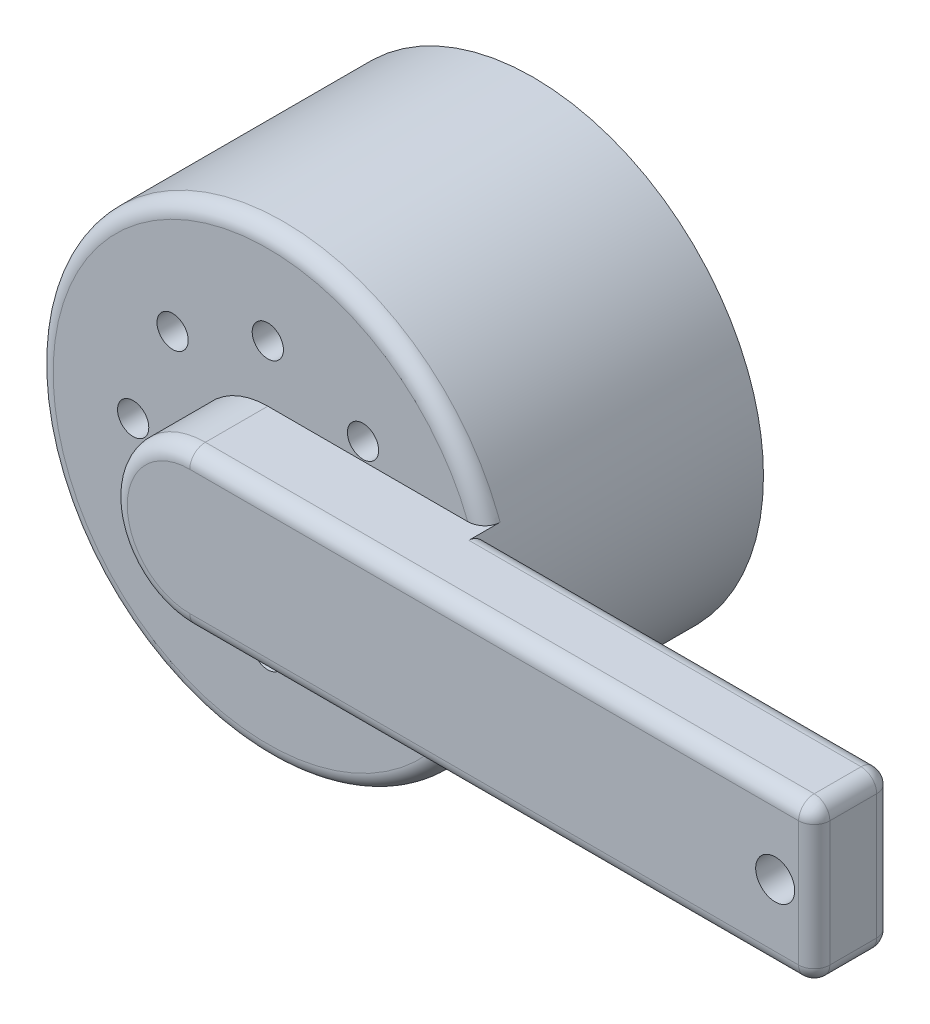
ISO-10303-21;
HEADER;
FILE_DESCRIPTION(('STEP AP214'),'2;1');
FILE_NAME('part.step','',(''),(''),'','','');
FILE_SCHEMA(('AUTOMOTIVE_DESIGN { 1 0 10303 214 1 1 1 1 }'));
ENDSEC;
DATA;
#1=APPLICATION_CONTEXT('core data for automotive mechanical design processes');
#2=APPLICATION_PROTOCOL_DEFINITION('international standard','automotive_design',2000,#1);
#3=PRODUCT_CONTEXT('',#1,'mechanical');
#4=PRODUCT('Part','Part','',(#3));
#5=PRODUCT_RELATED_PRODUCT_CATEGORY('part','',(#4));
#6=PRODUCT_DEFINITION_FORMATION('','',#4);
#7=PRODUCT_DEFINITION_CONTEXT('part definition',#1,'design');
#8=PRODUCT_DEFINITION('design','',#6,#7);
#9=PRODUCT_DEFINITION_SHAPE('','',#8);
#10=(LENGTH_UNIT() NAMED_UNIT(*) SI_UNIT(.MILLI.,.METRE.));
#11=(NAMED_UNIT(*) PLANE_ANGLE_UNIT() SI_UNIT($,.RADIAN.));
#12=(NAMED_UNIT(*) SI_UNIT($,.STERADIAN.) SOLID_ANGLE_UNIT());
#13=UNCERTAINTY_MEASURE_WITH_UNIT(LENGTH_MEASURE(1.E-05),#10,'distance_accuracy_value','');
#14=(GEOMETRIC_REPRESENTATION_CONTEXT(3) GLOBAL_UNCERTAINTY_ASSIGNED_CONTEXT((#13)) GLOBAL_UNIT_ASSIGNED_CONTEXT((#10,
#11,#12)) REPRESENTATION_CONTEXT('',''));
#15=CARTESIAN_POINT('',(0.,0.,0.));
#16=DIRECTION('',(0.,0.,1.));
#17=DIRECTION('',(1.,0.,0.));
#18=AXIS2_PLACEMENT_3D('',#15,#16,#17);
#19=CARTESIAN_POINT('',(0.,0.,15.));
#20=DIRECTION('',(0.,0.,1.));
#21=DIRECTION('',(1.,0.,0.));
#22=AXIS2_PLACEMENT_3D('',#19,#20,#21);
#23=TOROIDAL_SURFACE('',#22,27.5,2.);
#24=CARTESIAN_POINT('',(0.,0.,15.));
#25=DIRECTION('',(0.,0.,1.));
#26=DIRECTION('',(1.,0.,0.));
#27=AXIS2_PLACEMENT_3D('',#24,#25,#26);
#28=CIRCLE('',#27,29.5);
#29=CARTESIAN_POINT('',(27.7533781727558,-10.,15.));
#30=VERTEX_POINT('',#29);
#31=CARTESIAN_POINT('',(27.4804588723462,10.7272727272727,15.));
#32=VERTEX_POINT('',#31);
#33=EDGE_CURVE('E311',#30,#32,#28,.F.);
#34=ORIENTED_EDGE('',*,*,#33,.F.);
#35=CARTESIAN_POINT('',(25.617376914899,-10.,17.));
#36=CARTESIAN_POINT('',(25.68075721486,-10.,16.9999972384995));
#37=CARTESIAN_POINT('',(25.7441091277319,-10.,16.997384070362));
#38=CARTESIAN_POINT('',(25.8703882775707,-10.,16.9869278380014));
#39=CARTESIAN_POINT('',(25.93331545372,-10.,16.9790840402116));
#40=CARTESIAN_POINT('',(26.1209577172125,-10.,16.9476813547582));
#41=CARTESIAN_POINT('',(26.2444549626211,-10.,16.9162511531003));
#42=CARTESIAN_POINT('',(26.4844498616105,-10.,16.8328053780579));
#43=CARTESIAN_POINT('',(26.600937325635,-10.,16.7807606337093));
#44=CARTESIAN_POINT('',(26.8229529041866,-10.,16.6570717044338));
#45=CARTESIAN_POINT('',(26.9284897155197,-10.,16.585443239454));
#46=CARTESIAN_POINT('',(27.120872861918,-10.,16.4274951531692));
#47=CARTESIAN_POINT('',(27.2083027299105,-10.,16.3418873566717));
#48=CARTESIAN_POINT('',(27.3663383589333,-10.,16.1563220036238));
#49=CARTESIAN_POINT('',(27.436950187211,-10.,16.0563696429119));
#50=CARTESIAN_POINT('',(27.5545071607807,-10.,15.8519072874208));
#51=CARTESIAN_POINT('',(27.6026832829237,-10.,15.7481049780912));
#52=CARTESIAN_POINT('',(27.6798380828002,-10.,15.5336097940298));
#53=CARTESIAN_POINT('',(27.7088230751134,-10.,15.4229191989221));
#54=CARTESIAN_POINT('',(27.7453892455356,-10.,15.2040070534482));
#55=CARTESIAN_POINT('',(27.7540175331796,-10.,15.0959626180134));
#56=CARTESIAN_POINT('',(27.7530009947303,-10.,14.9340013867892));
#57=CARTESIAN_POINT('',(27.7503231634606,-10.,14.8799623187956));
#58=CARTESIAN_POINT('',(27.7403366667846,-10.,14.7723071711958));
#59=CARTESIAN_POINT('',(27.7330274574146,-10.,14.7186911420253));
#60=CARTESIAN_POINT('',(27.7234258659103,-10.,14.6654634963901));
#61=B_SPLINE_CURVE_WITH_KNOTS('',3,(#35,#36,#37,#38,#39,#40,#41,#42,#43,#44,#45,#46,#47,#48,#49,
#50,#51,#52,#53,#54,#55,#56,#57,#58,#59,#60),.UNSPECIFIED.,.F.,.F.,(4,2,2,2,2,2,2,2,2,2,2,2,4),
(0.,0.190029307111527,0.380085270379706,0.760430018899265,1.14131491471308,1.5218949654896,
1.88707370107852,2.25212049518283,2.59366591218452,2.93509889239672,3.25854527171672,
3.42068684311947,3.58284746187016),.UNSPECIFIED.);
#62=CARTESIAN_POINT('',(25.617376914899,-10.,17.));
#63=VERTEX_POINT('',#62);
#64=EDGE_CURVE('E56',#30,#63,#61,.F.);
#65=ORIENTED_EDGE('',*,*,#64,.T.);
#66=CARTESIAN_POINT('',(0.,0.,17.));
#67=DIRECTION('',(0.,0.,1.));
#68=DIRECTION('',(1.,0.,0.));
#69=AXIS2_PLACEMENT_3D('',#66,#67,#68);
#70=CIRCLE('',#69,27.5);
#71=CARTESIAN_POINT('',(25.617376914899,10.,17.));
#72=VERTEX_POINT('',#71);
#73=EDGE_CURVE('E150',#72,#63,#70,.T.);
#74=ORIENTED_EDGE('',*,*,#73,.F.);
#75=CARTESIAN_POINT('',(25.617376914899,10.,17.));
#76=CARTESIAN_POINT('',(25.68075721486,10.,16.9999972384995));
#77=CARTESIAN_POINT('',(25.7441091277319,10.,16.997384070362));
#78=CARTESIAN_POINT('',(25.8703882775707,10.,16.9869278380014));
#79=CARTESIAN_POINT('',(25.93331545372,10.,16.9790840402116));
#80=CARTESIAN_POINT('',(26.1209577172125,10.,16.9476813547582));
#81=CARTESIAN_POINT('',(26.2444549626211,10.,16.9162511531003));
#82=CARTESIAN_POINT('',(26.4844498616105,10.,16.8328053780579));
#83=CARTESIAN_POINT('',(26.600937325635,10.,16.7807606337093));
#84=CARTESIAN_POINT('',(26.8229529041866,10.,16.6570717044338));
#85=CARTESIAN_POINT('',(26.9284897155197,10.,16.585443239454));
#86=CARTESIAN_POINT('',(27.120872861918,10.,16.4274951531692));
#87=CARTESIAN_POINT('',(27.2083027299105,10.,16.3418873566717));
#88=CARTESIAN_POINT('',(27.3663383589333,10.,16.1563220036238));
#89=CARTESIAN_POINT('',(27.436950187211,10.,16.0563696429119));
#90=CARTESIAN_POINT('',(27.5545071607807,10.,15.8519072874208));
#91=CARTESIAN_POINT('',(27.6026832829237,10.,15.7481049780912));
#92=CARTESIAN_POINT('',(27.6798380828002,10.,15.5336097940298));
#93=CARTESIAN_POINT('',(27.7088230751134,10.,15.4229191989221));
#94=CARTESIAN_POINT('',(27.7453892455356,10.,15.2040070534482));
#95=CARTESIAN_POINT('',(27.7540175331796,10.,15.0959626180134));
#96=CARTESIAN_POINT('',(27.7530009947303,10.,14.9340013867892));
#97=CARTESIAN_POINT('',(27.7503231634606,10.,14.8799623187956));
#98=CARTESIAN_POINT('',(27.7403366667846,10.,14.7723071711958));
#99=CARTESIAN_POINT('',(27.7330274574146,10.,14.7186911420253));
#100=CARTESIAN_POINT('',(27.7234258659103,10.,14.6654634963901));
#101=B_SPLINE_CURVE_WITH_KNOTS('',3,(#75,#76,#77,#78,#79,#80,#81,#82,#83,#84,#85,#86,#87,#88,
#89,#90,#91,#92,#93,#94,#95,#96,#97,#98,#99,#100),.UNSPECIFIED.,.F.,.F.,(4,2,2,2,2,2,2,2,2,2,2,
2,4),(0.,0.190029307111527,0.380085270379706,0.760430018899265,1.14131491471308,1.5218949654896,
1.88707370107852,2.25212049518283,2.59366591218452,2.93509889239672,3.25854527171672,
3.42068684311947,3.58284746187016),.UNSPECIFIED.);
#102=CARTESIAN_POINT('',(27.7533781727558,10.,15.));
#103=VERTEX_POINT('',#102);
#104=EDGE_CURVE('E11',#72,#103,#101,.T.);
#105=ORIENTED_EDGE('',*,*,#104,.T.);
#106=CARTESIAN_POINT('',(0.,0.,15.));
#107=DIRECTION('',(0.,0.,1.));
#108=DIRECTION('',(1.,0.,0.));
#109=AXIS2_PLACEMENT_3D('',#106,#107,#108);
#110=CIRCLE('',#109,29.5);
#111=EDGE_CURVE('E314',#32,#103,#110,.F.);
#112=ORIENTED_EDGE('',*,*,#111,.F.);
#113=EDGE_LOOP('',(#34,#65,#74,#105,#112));
#114=FACE_BOUND('',#113,.T.);
#115=ADVANCED_FACE('F42',(#114),#23,.T.);
#116=CARTESIAN_POINT('',(78.,8.,17.));
#117=DIRECTION('',(0.,0.,1.));
#118=DIRECTION('',(1.,0.,0.));
#119=AXIS2_PLACEMENT_3D('',#116,#117,#118);
#120=CYLINDRICAL_SURFACE('',#119,2.);
#121=CARTESIAN_POINT('',(78.,8.,19.));
#122=DIRECTION('',(0.,0.,-1.));
#123=DIRECTION('',(-1.,0.,0.));
#124=AXIS2_PLACEMENT_3D('',#121,#122,#123);
#125=CIRCLE('',#124,2.);
#126=CARTESIAN_POINT('',(78.,10.,19.));
#127=VERTEX_POINT('',#126);
#128=CARTESIAN_POINT('',(80.,8.,19.));
#129=VERTEX_POINT('',#128);
#130=EDGE_CURVE('E318',#127,#129,#125,.T.);
#131=ORIENTED_EDGE('',*,*,#130,.F.);
#132=DIRECTION('',(0.,0.,-1.));
#133=VECTOR('',#132,1.);
#134=CARTESIAN_POINT('',(78.,10.,17.));
#135=LINE('',#134,#133);
#136=CARTESIAN_POINT('',(78.,10.,25.));
#137=VERTEX_POINT('',#136);
#138=EDGE_CURVE('E341',#137,#127,#135,.T.);
#139=ORIENTED_EDGE('',*,*,#138,.F.);
#140=CARTESIAN_POINT('',(78.,8.,25.));
#141=DIRECTION('',(0.,0.,-1.));
#142=DIRECTION('',(-1.,0.,0.));
#143=AXIS2_PLACEMENT_3D('',#140,#141,#142);
#144=CIRCLE('',#143,2.);
#145=CARTESIAN_POINT('',(80.,8.,25.));
#146=VERTEX_POINT('',#145);
#147=EDGE_CURVE('E321',#137,#146,#144,.T.);
#148=ORIENTED_EDGE('',*,*,#147,.T.);
#149=DIRECTION('',(0.,0.,-1.));
#150=VECTOR('',#149,1.);
#151=CARTESIAN_POINT('',(80.,8.,17.));
#152=LINE('',#151,#150);
#153=EDGE_CURVE('E365',#129,#146,#152,.F.);
#154=ORIENTED_EDGE('',*,*,#153,.F.);
#155=EDGE_LOOP('',(#131,#139,#148,#154));
#156=FACE_BOUND('',#155,.T.);
#157=ADVANCED_FACE('F542',(#156),#120,.T.);
#158=CARTESIAN_POINT('',(78.,8.,25.));
#159=DIRECTION('',(1.,0.,0.));
#160=DIRECTION('',(0.,0.,-1.));
#161=AXIS2_PLACEMENT_3D('',#158,#159,#160);
#162=SPHERICAL_SURFACE('',#161,2.);
#163=ORIENTED_EDGE('',*,*,#147,.F.);
#164=CARTESIAN_POINT('',(78.,8.,25.));
#165=DIRECTION('',(1.,0.,0.));
#166=DIRECTION('',(0.,0.,-1.));
#167=AXIS2_PLACEMENT_3D('',#164,#165,#166);
#168=CIRCLE('',#167,2.);
#169=CARTESIAN_POINT('',(78.,8.,27.));
#170=VERTEX_POINT('',#169);
#171=EDGE_CURVE('E345',#170,#137,#168,.F.);
#172=ORIENTED_EDGE('',*,*,#171,.F.);
#173=CARTESIAN_POINT('',(78.,8.,25.));
#174=DIRECTION('',(0.,1.,0.));
#175=DIRECTION('',(0.,0.,1.));
#176=AXIS2_PLACEMENT_3D('',#173,#174,#175);
#177=CIRCLE('',#176,2.);
#178=EDGE_CURVE('E324',#170,#146,#177,.T.);
#179=ORIENTED_EDGE('',*,*,#178,.T.);
#180=EDGE_LOOP('',(#163,#172,#179));
#181=FACE_BOUND('',#180,.T.);
#182=ADVANCED_FACE('F546',(#181),#162,.T.);
#183=CARTESIAN_POINT('',(78.,0.,25.));
#184=DIRECTION('',(0.,1.,0.));
#185=DIRECTION('',(0.,0.,1.));
#186=AXIS2_PLACEMENT_3D('',#183,#184,#185);
#187=CYLINDRICAL_SURFACE('',#186,2.);
#188=ORIENTED_EDGE('',*,*,#178,.F.);
#189=DIRECTION('',(0.,1.,0.));
#190=VECTOR('',#189,1.);
#191=CARTESIAN_POINT('',(78.,0.,27.));
#192=LINE('',#191,#190);
#193=CARTESIAN_POINT('',(78.,-8.,27.));
#194=VERTEX_POINT('',#193);
#195=EDGE_CURVE('E349',#194,#170,#192,.T.);
#196=ORIENTED_EDGE('',*,*,#195,.F.);
#197=CARTESIAN_POINT('',(78.,-8.,25.));
#198=DIRECTION('',(0.,1.,0.));
#199=DIRECTION('',(0.,0.,1.));
#200=AXIS2_PLACEMENT_3D('',#197,#198,#199);
#201=CIRCLE('',#200,2.);
#202=CARTESIAN_POINT('',(80.,-8.,25.));
#203=VERTEX_POINT('',#202);
#204=EDGE_CURVE('E328',#194,#203,#201,.T.);
#205=ORIENTED_EDGE('',*,*,#204,.T.);
#206=DIRECTION('',(0.,1.,0.));
#207=VECTOR('',#206,1.);
#208=CARTESIAN_POINT('',(80.,0.,25.));
#209=LINE('',#208,#207);
#210=EDGE_CURVE('E361',#146,#203,#209,.F.);
#211=ORIENTED_EDGE('',*,*,#210,.F.);
#212=EDGE_LOOP('',(#188,#196,#205,#211));
#213=FACE_BOUND('',#212,.T.);
#214=ADVANCED_FACE('F552',(#213),#187,.T.);
#215=CARTESIAN_POINT('',(78.,-8.,25.));
#216=DIRECTION('',(1.,0.,0.));
#217=DIRECTION('',(0.,0.,-1.));
#218=AXIS2_PLACEMENT_3D('',#215,#216,#217);
#219=SPHERICAL_SURFACE('',#218,2.);
#220=ORIENTED_EDGE('',*,*,#204,.F.);
#221=CARTESIAN_POINT('',(78.,-8.,25.));
#222=DIRECTION('',(1.,0.,0.));
#223=DIRECTION('',(0.,0.,-1.));
#224=AXIS2_PLACEMENT_3D('',#221,#222,#223);
#225=CIRCLE('',#224,2.);
#226=CARTESIAN_POINT('',(78.,-10.,25.));
#227=VERTEX_POINT('',#226);
#228=EDGE_CURVE('E353',#227,#194,#225,.F.);
#229=ORIENTED_EDGE('',*,*,#228,.F.);
#230=CARTESIAN_POINT('',(78.,-8.,25.));
#231=DIRECTION('',(0.,0.,1.));
#232=DIRECTION('',(1.,0.,0.));
#233=AXIS2_PLACEMENT_3D('',#230,#231,#232);
#234=CIRCLE('',#233,2.);
#235=EDGE_CURVE('E331',#227,#203,#234,.T.);
#236=ORIENTED_EDGE('',*,*,#235,.T.);
#237=EDGE_LOOP('',(#220,#229,#236));
#238=FACE_BOUND('',#237,.T.);
#239=ADVANCED_FACE('F583',(#238),#219,.T.);
#240=CARTESIAN_POINT('',(78.,-8.,27.));
#241=DIRECTION('',(0.,0.,-1.));
#242=DIRECTION('',(-1.,0.,0.));
#243=AXIS2_PLACEMENT_3D('',#240,#241,#242);
#244=CYLINDRICAL_SURFACE('',#243,2.);
#245=ORIENTED_EDGE('',*,*,#235,.F.);
#246=DIRECTION('',(0.,0.,1.));
#247=VECTOR('',#246,1.);
#248=CARTESIAN_POINT('',(78.,-10.,27.));
#249=LINE('',#248,#247);
#250=CARTESIAN_POINT('',(78.,-10.,19.));
#251=VERTEX_POINT('',#250);
#252=EDGE_CURVE('E369',#251,#227,#249,.T.);
#253=ORIENTED_EDGE('',*,*,#252,.F.);
#254=CARTESIAN_POINT('',(78.,-8.,19.));
#255=DIRECTION('',(0.,0.,1.));
#256=DIRECTION('',(1.,0.,0.));
#257=AXIS2_PLACEMENT_3D('',#254,#255,#256);
#258=CIRCLE('',#257,2.);
#259=CARTESIAN_POINT('',(80.,-8.,19.));
#260=VERTEX_POINT('',#259);
#261=EDGE_CURVE('E335',#251,#260,#258,.T.);
#262=ORIENTED_EDGE('',*,*,#261,.T.);
#263=DIRECTION('',(0.,0.,1.));
#264=VECTOR('',#263,1.);
#265=CARTESIAN_POINT('',(80.,-8.,27.));
#266=LINE('',#265,#264);
#267=EDGE_CURVE('E357',#203,#260,#266,.F.);
#268=ORIENTED_EDGE('',*,*,#267,.F.);
#269=EDGE_LOOP('',(#245,#253,#262,#268));
#270=FACE_BOUND('',#269,.T.);
#271=ADVANCED_FACE('F564',(#270),#244,.T.);
#272=CARTESIAN_POINT('',(78.,-8.,19.));
#273=DIRECTION('',(0.,0.,1.));
#274=DIRECTION('',(1.,0.,0.));
#275=AXIS2_PLACEMENT_3D('',#272,#273,#274);
#276=SPHERICAL_SURFACE('',#275,2.);
#277=ORIENTED_EDGE('',*,*,#261,.F.);
#278=CARTESIAN_POINT('',(78.,-8.,19.));
#279=DIRECTION('',(-1.,0.,0.));
#280=DIRECTION('',(0.,0.,1.));
#281=AXIS2_PLACEMENT_3D('',#278,#279,#280);
#282=CIRCLE('',#281,2.);
#283=CARTESIAN_POINT('',(78.,-8.,17.));
#284=VERTEX_POINT('',#283);
#285=EDGE_CURVE('E379',#284,#251,#282,.T.);
#286=ORIENTED_EDGE('',*,*,#285,.F.);
#287=CARTESIAN_POINT('',(78.,-8.,19.));
#288=DIRECTION('',(0.,1.,0.));
#289=DIRECTION('',(0.,0.,1.));
#290=AXIS2_PLACEMENT_3D('',#287,#288,#289);
#291=CIRCLE('',#290,2.);
#292=EDGE_CURVE('E372',#260,#284,#291,.T.);
#293=ORIENTED_EDGE('',*,*,#292,.F.);
#294=EDGE_LOOP('',(#277,#286,#293));
#295=FACE_BOUND('',#294,.T.);
#296=ADVANCED_FACE('F426',(#295),#276,.T.);
#297=CARTESIAN_POINT('',(78.,8.,19.));
#298=DIRECTION('',(0.,0.,1.));
#299=DIRECTION('',(1.,0.,0.));
#300=AXIS2_PLACEMENT_3D('',#297,#298,#299);
#301=SPHERICAL_SURFACE('',#300,2.);
#302=CARTESIAN_POINT('',(78.,8.,19.));
#303=DIRECTION('',(1.,0.,0.));
#304=DIRECTION('',(0.,0.,-1.));
#305=AXIS2_PLACEMENT_3D('',#302,#303,#304);
#306=CIRCLE('',#305,2.);
#307=CARTESIAN_POINT('',(78.,8.,17.));
#308=VERTEX_POINT('',#307);
#309=EDGE_CURVE('E338',#127,#308,#306,.F.);
#310=ORIENTED_EDGE('',*,*,#309,.F.);
#311=ORIENTED_EDGE('',*,*,#130,.T.);
#312=CARTESIAN_POINT('',(78.,8.,19.));
#313=DIRECTION('',(0.,1.,0.));
#314=DIRECTION('',(0.,0.,1.));
#315=AXIS2_PLACEMENT_3D('',#312,#313,#314);
#316=CIRCLE('',#315,2.);
#317=EDGE_CURVE('E375',#308,#129,#316,.F.);
#318=ORIENTED_EDGE('',*,*,#317,.F.);
#319=EDGE_LOOP('',(#310,#311,#318));
#320=FACE_BOUND('',#319,.T.);
#321=ADVANCED_FACE('F556',(#320),#301,.T.);
#322=CARTESIAN_POINT('',(78.,-10.,19.));
#323=DIRECTION('',(0.,1.,0.));
#324=DIRECTION('',(0.,0.,1.));
#325=AXIS2_PLACEMENT_3D('',#322,#323,#324);
#326=CYLINDRICAL_SURFACE('',#325,2.);
#327=DIRECTION('',(0.,-1.,0.));
#328=VECTOR('',#327,1.);
#329=CARTESIAN_POINT('',(80.,-10.,19.));
#330=LINE('',#329,#328);
#331=EDGE_CURVE('E211',#260,#129,#330,.F.);
#332=ORIENTED_EDGE('',*,*,#331,.F.);
#333=ORIENTED_EDGE('',*,*,#292,.T.);
#334=DIRECTION('',(0.,-1.,0.));
#335=VECTOR('',#334,1.);
#336=CARTESIAN_POINT('',(78.,-10.,17.));
#337=LINE('',#336,#335);
#338=EDGE_CURVE('E196',#308,#284,#337,.T.);
#339=ORIENTED_EDGE('',*,*,#338,.F.);
#340=ORIENTED_EDGE('',*,*,#317,.T.);
#341=EDGE_LOOP('',(#332,#333,#339,#340));
#342=FACE_BOUND('',#341,.T.);
#343=ADVANCED_FACE('F422',(#342),#326,.T.);
#344=CARTESIAN_POINT('',(80.,8.,19.));
#345=DIRECTION('',(1.,0.,0.));
#346=DIRECTION('',(0.,0.,-1.));
#347=AXIS2_PLACEMENT_3D('',#344,#345,#346);
#348=CYLINDRICAL_SURFACE('',#347,2.);
#349=DIRECTION('',(1.,0.,0.));
#350=VECTOR('',#349,1.);
#351=CARTESIAN_POINT('',(80.,10.,19.));
#352=LINE('',#351,#350);
#353=CARTESIAN_POINT('',(27.7533781727558,10.,19.));
#354=VERTEX_POINT('',#353);
#355=EDGE_CURVE('E208',#127,#354,#352,.F.);
#356=ORIENTED_EDGE('',*,*,#355,.F.);
#357=ORIENTED_EDGE('',*,*,#309,.T.);
#358=DIRECTION('',(1.,0.,0.));
#359=VECTOR('',#358,1.);
#360=CARTESIAN_POINT('',(80.,8.,17.));
#361=LINE('',#360,#359);
#362=CARTESIAN_POINT('',(28.3945417290014,8.,17.));
#363=VERTEX_POINT('',#362);
#364=EDGE_CURVE('E201',#363,#308,#361,.T.);
#365=ORIENTED_EDGE('',*,*,#364,.F.);
#366=CARTESIAN_POINT('',(28.3945417290014,8.,17.));
#367=CARTESIAN_POINT('',(28.3780414979525,8.05856841364133,17.0000015783388));
#368=CARTESIAN_POINT('',(28.3613661593498,8.11705554224738,17.0025740292606));
#369=CARTESIAN_POINT('',(28.3277778118286,8.23350884605877,17.0128175070188));
#370=CARTESIAN_POINT('',(28.3108648183066,8.29147505461665,17.0204882050424));
#371=CARTESIAN_POINT('',(28.2599691533946,8.46395011337387,17.0510628573682));
#372=CARTESIAN_POINT('',(28.2257960715001,8.57715494111195,17.081529556825));
#373=CARTESIAN_POINT('',(28.1581484794017,8.79669888909864,17.1618062752454));
#374=CARTESIAN_POINT('',(28.1246742566194,8.90303522075574,17.2116240938543));
#375=CARTESIAN_POINT('',(28.0596755500358,9.10581918024377,17.3294014917866));
#376=CARTESIAN_POINT('',(28.0281507933764,9.20226819320795,17.3973585251327));
#377=CARTESIAN_POINT('',(27.9686748266675,9.38147526415871,17.5490745639991));
#378=CARTESIAN_POINT('',(27.9406932109466,9.46435190100384,17.63268131451));
#379=CARTESIAN_POINT('',(27.8893169980748,9.61469314988261,17.8139911340542));
#380=CARTESIAN_POINT('',(27.865920900519,9.68216280435595,17.9116895739908));
#381=CARTESIAN_POINT('',(27.8259113127535,9.79653917906212,18.1138081346267));
#382=CARTESIAN_POINT('',(27.8090424491679,9.84422696358761,18.2177360749637));
#383=CARTESIAN_POINT('',(27.7816246908679,9.9213422643204,18.4330091612795));
#384=CARTESIAN_POINT('',(27.7710733018938,9.95077698734923,18.5443513606474));
#385=CARTESIAN_POINT('',(27.7606682605708,9.9797483614033,18.7109350245364));
#386=CARTESIAN_POINT('',(27.758107466733,9.9868660503482,18.7647986600304));
#387=CARTESIAN_POINT('',(27.7545672670888,9.99670079590739,18.8729925854463));
#388=CARTESIAN_POINT('',(27.753587799818,9.99941802356263,18.9273228571481));
#389=CARTESIAN_POINT('',(27.7532286911943,10.0004150519399,19.0361342966438));
#390=CARTESIAN_POINT('',(27.7538522634751,9.9986859390246,19.0906155484899));
#391=CARTESIAN_POINT('',(27.7566915314675,9.99079948704035,19.1992224015677));
#392=CARTESIAN_POINT('',(27.7589074461481,9.98464153894596,19.2533479528527));
#393=CARTESIAN_POINT('',(27.7619121984254,9.97628343056262,19.3070892412372));
#394=B_SPLINE_CURVE_WITH_KNOTS('',3,(#366,#367,#368,#369,#370,#371,#372,#373,#374,#375,#376,
#377,#378,#379,#380,#381,#382,#383,#384,#385,#386,#387,#388,#389,#390,#391,#392,#393),
.UNSPECIFIED.,.F.,.F.,(4,2,2,2,2,2,2,2,2,2,2,2,2,4),(0.,0.182430158033712,0.364848551324199,
0.729317427446627,1.09393335876651,1.45849814034317,1.81968488113096,2.18075324176066,
2.5257634714443,2.87063739452009,3.0336504550413,3.196657179277,3.35999093988057,
3.52334716540756),.UNSPECIFIED.);
#395=EDGE_CURVE('E222',#363,#354,#394,.T.);
#396=ORIENTED_EDGE('',*,*,#395,.T.);
#397=EDGE_LOOP('',(#356,#357,#365,#396));
#398=FACE_BOUND('',#397,.T.);
#399=ADVANCED_FACE('F239',(#398),#348,.T.);
#400=CARTESIAN_POINT('',(80.,-8.,19.));
#401=DIRECTION('',(-1.,0.,0.));
#402=DIRECTION('',(0.,0.,1.));
#403=AXIS2_PLACEMENT_3D('',#400,#401,#402);
#404=CYLINDRICAL_SURFACE('',#403,2.);
#405=DIRECTION('',(-1.,0.,0.));
#406=VECTOR('',#405,1.);
#407=CARTESIAN_POINT('',(80.,-8.,17.));
#408=LINE('',#407,#406);
#409=CARTESIAN_POINT('',(28.3945417290014,-8.,17.));
#410=VERTEX_POINT('',#409);
#411=EDGE_CURVE('E192',#284,#410,#408,.T.);
#412=ORIENTED_EDGE('',*,*,#411,.F.);
#413=ORIENTED_EDGE('',*,*,#285,.T.);
#414=DIRECTION('',(-1.,0.,0.));
#415=VECTOR('',#414,1.);
#416=CARTESIAN_POINT('',(80.,-10.,19.));
#417=LINE('',#416,#415);
#418=CARTESIAN_POINT('',(27.7533781727558,-10.,19.));
#419=VERTEX_POINT('',#418);
#420=EDGE_CURVE('E219',#419,#251,#417,.F.);
#421=ORIENTED_EDGE('',*,*,#420,.F.);
#422=CARTESIAN_POINT('',(28.3945417290014,-8.,17.));
#423=CARTESIAN_POINT('',(28.3780414979525,-8.05856841364133,17.0000015783388));
#424=CARTESIAN_POINT('',(28.3613661593498,-8.11705554224738,17.0025740292606));
#425=CARTESIAN_POINT('',(28.3277778118286,-8.23350884605877,17.0128175070188));
#426=CARTESIAN_POINT('',(28.3108648183066,-8.29147505461665,17.0204882050424));
#427=CARTESIAN_POINT('',(28.2599691533946,-8.46395011337387,17.0510628573682));
#428=CARTESIAN_POINT('',(28.2257960715001,-8.57715494111195,17.081529556825));
#429=CARTESIAN_POINT('',(28.1581484794017,-8.79669888909864,17.1618062752454));
#430=CARTESIAN_POINT('',(28.1246742566194,-8.90303522075574,17.2116240938543));
#431=CARTESIAN_POINT('',(28.0596755500358,-9.10581918024377,17.3294014917866));
#432=CARTESIAN_POINT('',(28.0281507933764,-9.20226819320795,17.3973585251327));
#433=CARTESIAN_POINT('',(27.9686748266675,-9.38147526415871,17.5490745639991));
#434=CARTESIAN_POINT('',(27.9406932109466,-9.46435190100384,17.63268131451));
#435=CARTESIAN_POINT('',(27.8893169980748,-9.6146931498826,17.8139911340542));
#436=CARTESIAN_POINT('',(27.865920900519,-9.68216280435595,17.9116895739908));
#437=CARTESIAN_POINT('',(27.8259113127535,-9.79653917906212,18.1138081346267));
#438=CARTESIAN_POINT('',(27.8090424491679,-9.84422696358761,18.2177360749637));
#439=CARTESIAN_POINT('',(27.7816246908679,-9.9213422643204,18.4330091612795));
#440=CARTESIAN_POINT('',(27.7710733018938,-9.95077698734923,18.5443513606474));
#441=CARTESIAN_POINT('',(27.7606682605708,-9.9797483614033,18.7109350245364));
#442=CARTESIAN_POINT('',(27.758107466733,-9.9868660503482,18.7647986600304));
#443=CARTESIAN_POINT('',(27.7545672670888,-9.99670079590739,18.8729925854463));
#444=CARTESIAN_POINT('',(27.753587799818,-9.99941802356262,18.9273228571481));
#445=CARTESIAN_POINT('',(27.7532286911943,-10.0004150519399,19.0361342966438));
#446=CARTESIAN_POINT('',(27.7538522634751,-9.99868593902459,19.0906155484899));
#447=CARTESIAN_POINT('',(27.7566915314675,-9.99079948704035,19.1992224015677));
#448=CARTESIAN_POINT('',(27.7589074461481,-9.98464153894596,19.2533479528527));
#449=CARTESIAN_POINT('',(27.7619121984254,-9.97628343056261,19.3070892412373));
#450=B_SPLINE_CURVE_WITH_KNOTS('',3,(#422,#423,#424,#425,#426,#427,#428,#429,#430,#431,#432,
#433,#434,#435,#436,#437,#438,#439,#440,#441,#442,#443,#444,#445,#446,#447,#448,#449),
.UNSPECIFIED.,.F.,.F.,(4,2,2,2,2,2,2,2,2,2,2,2,2,4),(0.,0.18243015803371,0.364848551324198,
0.729317427446627,1.09393335876651,1.45849814034317,1.81968488113096,2.18075324176067,
2.5257634714443,2.87063739452009,3.0336504550413,3.196657179277,3.35999093988057,
3.52334716540757),.UNSPECIFIED.);
#451=EDGE_CURVE('E232',#419,#410,#450,.F.);
#452=ORIENTED_EDGE('',*,*,#451,.T.);
#453=EDGE_LOOP('',(#412,#413,#421,#452));
#454=FACE_BOUND('',#453,.T.);
#455=ADVANCED_FACE('F254',(#454),#404,.T.);
#456=CARTESIAN_POINT('',(0.,0.,17.));
#457=DIRECTION('',(0.,0.,1.));
#458=DIRECTION('',(1.,0.,0.));
#459=AXIS2_PLACEMENT_3D('',#456,#457,#458);
#460=PLANE('',#459);
#461=CARTESIAN_POINT('',(-12.1975919754681,-12.1975919754678,17.));
#462=DIRECTION('',(0.,0.,1.));
#463=DIRECTION('',(1.,0.,0.));
#464=AXIS2_PLACEMENT_3D('',#461,#462,#463);
#465=CIRCLE('',#464,2.);
#466=CARTESIAN_POINT('',(-10.1975919754681,-12.1975919754678,17.));
#467=VERTEX_POINT('',#466);
#468=EDGE_CURVE('E178',#467,#467,#465,.T.);
#469=ORIENTED_EDGE('',*,*,#468,.F.);
#470=EDGE_LOOP('',(#469));
#471=FACE_BOUND('',#470,.T.);
#472=CARTESIAN_POINT('',(-1.80684159285132E-13,-17.25,17.));
#473=DIRECTION('',(0.,0.,1.));
#474=DIRECTION('',(1.,0.,0.));
#475=AXIS2_PLACEMENT_3D('',#472,#473,#474);
#476=CIRCLE('',#475,2.);
#477=CARTESIAN_POINT('',(1.99999999999982,-17.25,17.));
#478=VERTEX_POINT('',#477);
#479=EDGE_CURVE('E440',#478,#478,#476,.T.);
#480=ORIENTED_EDGE('',*,*,#479,.F.);
#481=EDGE_LOOP('',(#480));
#482=FACE_BOUND('',#481,.T.);
#483=CARTESIAN_POINT('',(12.1975919754678,-12.197591975468,17.));
#484=DIRECTION('',(0.,0.,1.));
#485=DIRECTION('',(1.,0.,0.));
#486=AXIS2_PLACEMENT_3D('',#483,#484,#485);
#487=CIRCLE('',#486,2.);
#488=CARTESIAN_POINT('',(14.1975919754678,-12.197591975468,17.));
#489=VERTEX_POINT('',#488);
#490=EDGE_CURVE('E445',#489,#489,#487,.T.);
#491=ORIENTED_EDGE('',*,*,#490,.F.);
#492=EDGE_LOOP('',(#491));
#493=FACE_BOUND('',#492,.T.);
#494=CARTESIAN_POINT('',(12.197591975468,12.1975919754679,17.));
#495=DIRECTION('',(0.,0.,1.));
#496=DIRECTION('',(1.,0.,0.));
#497=AXIS2_PLACEMENT_3D('',#494,#495,#496);
#498=CIRCLE('',#497,2.);
#499=CARTESIAN_POINT('',(14.197591975468,12.1975919754679,17.));
#500=VERTEX_POINT('',#499);
#501=EDGE_CURVE('E450',#500,#500,#498,.T.);
#502=ORIENTED_EDGE('',*,*,#501,.F.);
#503=EDGE_LOOP('',(#502));
#504=FACE_BOUND('',#503,.T.);
#505=CARTESIAN_POINT('',(0.,17.25,17.));
#506=DIRECTION('',(0.,0.,1.));
#507=DIRECTION('',(1.,0.,0.));
#508=AXIS2_PLACEMENT_3D('',#505,#506,#507);
#509=CIRCLE('',#508,2.);
#510=CARTESIAN_POINT('',(2.00000000000006,17.25,17.));
#511=VERTEX_POINT('',#510);
#512=EDGE_CURVE('E456',#511,#511,#509,.T.);
#513=ORIENTED_EDGE('',*,*,#512,.F.);
#514=EDGE_LOOP('',(#513));
#515=FACE_BOUND('',#514,.T.);
#516=CARTESIAN_POINT('',(-12.1975919754679,12.197591975468,17.));
#517=DIRECTION('',(0.,0.,1.));
#518=DIRECTION('',(1.,0.,0.));
#519=AXIS2_PLACEMENT_3D('',#516,#517,#518);
#520=CIRCLE('',#519,2.);
#521=CARTESIAN_POINT('',(-10.1975919754679,12.197591975468,17.));
#522=VERTEX_POINT('',#521);
#523=EDGE_CURVE('E461',#522,#522,#520,.T.);
#524=ORIENTED_EDGE('',*,*,#523,.F.);
#525=EDGE_LOOP('',(#524));
#526=FACE_BOUND('',#525,.T.);
#527=CARTESIAN_POINT('',(-17.25,0.,17.));
#528=DIRECTION('',(0.,0.,1.));
#529=DIRECTION('',(1.,0.,0.));
#530=AXIS2_PLACEMENT_3D('',#527,#528,#529);
#531=CIRCLE('',#530,2.);
#532=CARTESIAN_POINT('',(-15.25,0.,17.));
#533=VERTEX_POINT('',#532);
#534=EDGE_CURVE('E465',#533,#533,#531,.T.);
#535=ORIENTED_EDGE('',*,*,#534,.F.);
#536=EDGE_LOOP('',(#535));
#537=FACE_BOUND('',#536,.T.);
#538=DIRECTION('',(-1.,0.,0.));
#539=VECTOR('',#538,1.);
#540=CARTESIAN_POINT('',(80.,10.,17.));
#541=LINE('',#540,#539);
#542=CARTESIAN_POINT('',(0.,10.,17.));
#543=VERTEX_POINT('',#542);
#544=EDGE_CURVE('E154',#72,#543,#541,.T.);
#545=ORIENTED_EDGE('',*,*,#544,.F.);
#546=ORIENTED_EDGE('',*,*,#73,.T.);
#547=DIRECTION('',(-1.,0.,0.));
#548=VECTOR('',#547,1.);
#549=CARTESIAN_POINT('',(80.,-10.,17.));
#550=LINE('',#549,#548);
#551=CARTESIAN_POINT('',(0.,-10.,17.));
#552=VERTEX_POINT('',#551);
#553=EDGE_CURVE('E144',#63,#552,#550,.T.);
#554=ORIENTED_EDGE('',*,*,#553,.T.);
#555=CARTESIAN_POINT('',(0.,0.,17.));
#556=DIRECTION('',(0.,0.,1.));
#557=DIRECTION('',(1.,0.,0.));
#558=AXIS2_PLACEMENT_3D('',#555,#556,#557);
#559=CIRCLE('',#558,10.);
#560=EDGE_CURVE('E149',#552,#543,#559,.F.);
#561=ORIENTED_EDGE('',*,*,#560,.T.);
#562=EDGE_LOOP('',(#545,#546,#554,#561));
#563=FACE_BOUND('',#562,.T.);
#564=ADVANCED_FACE('F147',(#471,#482,#493,#504,#515,#526,#537,#563),#460,.T.);
#565=CARTESIAN_POINT('',(0.,0.,27.));
#566=DIRECTION('',(0.,0.,-1.));
#567=DIRECTION('',(-1.,0.,0.));
#568=AXIS2_PLACEMENT_3D('',#565,#566,#567);
#569=CYLINDRICAL_SURFACE('',#568,10.);
#570=DIRECTION('',(0.,0.,-1.));
#571=VECTOR('',#570,1.);
#572=CARTESIAN_POINT('',(0.,-10.,27.));
#573=LINE('',#572,#571);
#574=CARTESIAN_POINT('',(0.,-10.,25.));
#575=VERTEX_POINT('',#574);
#576=EDGE_CURVE('E157',#575,#552,#573,.T.);
#577=ORIENTED_EDGE('',*,*,#576,.F.);
#578=CARTESIAN_POINT('',(0.,0.,25.));
#579=DIRECTION('',(0.,0.,1.));
#580=DIRECTION('',(1.,0.,0.));
#581=AXIS2_PLACEMENT_3D('',#578,#579,#580);
#582=CIRCLE('',#581,10.);
#583=CARTESIAN_POINT('',(0.,10.,25.));
#584=VERTEX_POINT('',#583);
#585=EDGE_CURVE('E393',#575,#584,#582,.F.);
#586=ORIENTED_EDGE('',*,*,#585,.T.);
#587=DIRECTION('',(0.,0.,1.));
#588=VECTOR('',#587,1.);
#589=CARTESIAN_POINT('',(0.,10.,17.));
#590=LINE('',#589,#588);
#591=EDGE_CURVE('E166',#543,#584,#590,.T.);
#592=ORIENTED_EDGE('',*,*,#591,.F.);
#593=ORIENTED_EDGE('',*,*,#560,.F.);
#594=EDGE_LOOP('',(#577,#586,#592,#593));
#595=FACE_BOUND('',#594,.T.);
#596=ADVANCED_FACE('F169',(#595),#569,.T.);
#597=CARTESIAN_POINT('',(0.,0.,17.));
#598=DIRECTION('',(0.,0.,-1.));
#599=DIRECTION('',(-1.,0.,0.));
#600=AXIS2_PLACEMENT_3D('',#597,#598,#599);
#601=CYLINDRICAL_SURFACE('',#600,29.5);
#602=DIRECTION('',(0.,0.,-1.));
#603=VECTOR('',#602,1.);
#604=CARTESIAN_POINT('',(27.7533781727558,-10.,17.));
#605=LINE('',#604,#603);
#606=EDGE_CURVE('E215',#30,#419,#605,.F.);
#607=ORIENTED_EDGE('',*,*,#606,.F.);
#608=ORIENTED_EDGE('',*,*,#33,.T.);
#609=ORIENTED_EDGE('',*,*,#111,.T.);
#610=DIRECTION('',(0.,0.,-1.));
#611=VECTOR('',#610,1.);
#612=CARTESIAN_POINT('',(27.7533781727558,10.,17.));
#613=LINE('',#612,#611);
#614=EDGE_CURVE('E205',#354,#103,#613,.T.);
#615=ORIENTED_EDGE('',*,*,#614,.F.);
#616=ORIENTED_EDGE('',*,*,#395,.F.);
#617=CARTESIAN_POINT('',(0.,0.,17.));
#618=DIRECTION('',(0.,0.,1.));
#619=DIRECTION('',(1.,0.,0.));
#620=AXIS2_PLACEMENT_3D('',#617,#618,#619);
#621=CIRCLE('',#620,29.5);
#622=EDGE_CURVE('E173',#410,#363,#621,.T.);
#623=ORIENTED_EDGE('',*,*,#622,.F.);
#624=ORIENTED_EDGE('',*,*,#451,.F.);
#625=EDGE_LOOP('',(#607,#608,#609,#615,#616,#623,#624));
#626=FACE_BOUND('',#625,.T.);
#627=CARTESIAN_POINT('',(0.,0.,-17.));
#628=DIRECTION('',(0.,0.,1.));
#629=DIRECTION('',(1.,0.,0.));
#630=AXIS2_PLACEMENT_3D('',#627,#628,#629);
#631=CIRCLE('',#630,29.5);
#632=CARTESIAN_POINT('',(29.5,0.,-17.));
#633=VERTEX_POINT('',#632);
#634=EDGE_CURVE('E197',#633,#633,#631,.T.);
#635=ORIENTED_EDGE('',*,*,#634,.T.);
#636=EDGE_LOOP('',(#635));
#637=FACE_BOUND('',#636,.T.);
#638=ADVANCED_FACE('F241',(#626,#637),#601,.T.);
#639=CARTESIAN_POINT('',(0.,0.,-17.));
#640=DIRECTION('',(0.,0.,1.));
#641=DIRECTION('',(1.,0.,0.));
#642=AXIS2_PLACEMENT_3D('',#639,#640,#641);
#643=PLANE('',#642);
#644=CARTESIAN_POINT('',(-17.25,0.,-17.));
#645=DIRECTION('',(0.,0.,1.));
#646=DIRECTION('',(1.,0.,0.));
#647=AXIS2_PLACEMENT_3D('',#644,#645,#646);
#648=CIRCLE('',#647,2.);
#649=CARTESIAN_POINT('',(-15.25,0.,-17.));
#650=VERTEX_POINT('',#649);
#651=EDGE_CURVE('E184',#650,#650,#648,.T.);
#652=ORIENTED_EDGE('',*,*,#651,.T.);
#653=EDGE_LOOP('',(#652));
#654=FACE_BOUND('',#653,.T.);
#655=CARTESIAN_POINT('',(-12.1975919754679,12.197591975468,-17.));
#656=DIRECTION('',(0.,0.,1.));
#657=DIRECTION('',(1.,0.,0.));
#658=AXIS2_PLACEMENT_3D('',#655,#656,#657);
#659=CIRCLE('',#658,2.);
#660=CARTESIAN_POINT('',(-10.1975919754679,12.197591975468,-17.));
#661=VERTEX_POINT('',#660);
#662=EDGE_CURVE('E460',#661,#661,#659,.T.);
#663=ORIENTED_EDGE('',*,*,#662,.T.);
#664=EDGE_LOOP('',(#663));
#665=FACE_BOUND('',#664,.T.);
#666=CARTESIAN_POINT('',(0.,17.25,-17.));
#667=DIRECTION('',(0.,0.,1.));
#668=DIRECTION('',(1.,0.,0.));
#669=AXIS2_PLACEMENT_3D('',#666,#667,#668);
#670=CIRCLE('',#669,2.);
#671=CARTESIAN_POINT('',(2.00000000000006,17.25,-17.));
#672=VERTEX_POINT('',#671);
#673=EDGE_CURVE('E454',#672,#672,#670,.T.);
#674=ORIENTED_EDGE('',*,*,#673,.T.);
#675=EDGE_LOOP('',(#674));
#676=FACE_BOUND('',#675,.T.);
#677=CARTESIAN_POINT('',(12.197591975468,12.1975919754679,-17.));
#678=DIRECTION('',(0.,0.,1.));
#679=DIRECTION('',(1.,0.,0.));
#680=AXIS2_PLACEMENT_3D('',#677,#678,#679);
#681=CIRCLE('',#680,2.);
#682=CARTESIAN_POINT('',(14.197591975468,12.1975919754679,-17.));
#683=VERTEX_POINT('',#682);
#684=EDGE_CURVE('E455',#683,#683,#681,.T.);
#685=ORIENTED_EDGE('',*,*,#684,.T.);
#686=EDGE_LOOP('',(#685));
#687=FACE_BOUND('',#686,.T.);
#688=CARTESIAN_POINT('',(17.25,-1.20456106190088E-13,-17.));
#689=DIRECTION('',(0.,0.,1.));
#690=DIRECTION('',(1.,0.,0.));
#691=AXIS2_PLACEMENT_3D('',#688,#689,#690);
#692=CIRCLE('',#691,2.);
#693=CARTESIAN_POINT('',(19.25,-1.20456106190088E-13,-17.));
#694=VERTEX_POINT('',#693);
#695=EDGE_CURVE('E449',#694,#694,#692,.T.);
#696=ORIENTED_EDGE('',*,*,#695,.T.);
#697=EDGE_LOOP('',(#696));
#698=FACE_BOUND('',#697,.T.);
#699=CARTESIAN_POINT('',(12.1975919754678,-12.197591975468,-17.));
#700=DIRECTION('',(0.,0.,1.));
#701=DIRECTION('',(1.,0.,0.));
#702=AXIS2_PLACEMENT_3D('',#699,#700,#701);
#703=CIRCLE('',#702,2.);
#704=CARTESIAN_POINT('',(14.1975919754678,-12.197591975468,-17.));
#705=VERTEX_POINT('',#704);
#706=EDGE_CURVE('E444',#705,#705,#703,.T.);
#707=ORIENTED_EDGE('',*,*,#706,.T.);
#708=EDGE_LOOP('',(#707));
#709=FACE_BOUND('',#708,.T.);
#710=CARTESIAN_POINT('',(-1.80684159285132E-13,-17.25,-17.));
#711=DIRECTION('',(0.,0.,1.));
#712=DIRECTION('',(1.,0.,0.));
#713=AXIS2_PLACEMENT_3D('',#710,#711,#712);
#714=CIRCLE('',#713,2.);
#715=CARTESIAN_POINT('',(1.99999999999982,-17.25,-17.));
#716=VERTEX_POINT('',#715);
#717=EDGE_CURVE('E439',#716,#716,#714,.T.);
#718=ORIENTED_EDGE('',*,*,#717,.T.);
#719=EDGE_LOOP('',(#718));
#720=FACE_BOUND('',#719,.T.);
#721=CARTESIAN_POINT('',(-12.1975919754681,-12.1975919754678,-17.));
#722=DIRECTION('',(0.,0.,1.));
#723=DIRECTION('',(1.,0.,0.));
#724=AXIS2_PLACEMENT_3D('',#721,#722,#723);
#725=CIRCLE('',#724,2.);
#726=CARTESIAN_POINT('',(-10.1975919754681,-12.1975919754678,-17.));
#727=VERTEX_POINT('',#726);
#728=EDGE_CURVE('E172',#727,#727,#725,.T.);
#729=ORIENTED_EDGE('',*,*,#728,.T.);
#730=EDGE_LOOP('',(#729));
#731=FACE_BOUND('',#730,.T.);
#732=ORIENTED_EDGE('',*,*,#634,.F.);
#733=EDGE_LOOP('',(#732));
#734=FACE_BOUND('',#733,.T.);
#735=ADVANCED_FACE('F245',(#654,#665,#676,#687,#698,#709,#720,#731,#734),#643,.F.);
#736=CARTESIAN_POINT('',(-12.1975919754681,-12.1975919754678,-135.875));
#737=DIRECTION('',(0.,0.,1.));
#738=DIRECTION('',(1.,0.,0.));
#739=AXIS2_PLACEMENT_3D('',#736,#737,#738);
#740=CYLINDRICAL_SURFACE('',#739,2.);
#741=ORIENTED_EDGE('',*,*,#468,.T.);
#742=EDGE_LOOP('',(#741));
#743=FACE_BOUND('',#742,.T.);
#744=ORIENTED_EDGE('',*,*,#728,.F.);
#745=EDGE_LOOP('',(#744));
#746=FACE_BOUND('',#745,.T.);
#747=ADVANCED_FACE('F250',(#743,#746),#740,.F.);
#748=CARTESIAN_POINT('',(-1.80684159285132E-13,-17.25,-135.875));
#749=DIRECTION('',(0.,0.,1.));
#750=DIRECTION('',(1.,0.,0.));
#751=AXIS2_PLACEMENT_3D('',#748,#749,#750);
#752=CYLINDRICAL_SURFACE('',#751,2.);
#753=ORIENTED_EDGE('',*,*,#479,.T.);
#754=EDGE_LOOP('',(#753));
#755=FACE_BOUND('',#754,.T.);
#756=ORIENTED_EDGE('',*,*,#717,.F.);
#757=EDGE_LOOP('',(#756));
#758=FACE_BOUND('',#757,.T.);
#759=ADVANCED_FACE('F258',(#755,#758),#752,.F.);
#760=CARTESIAN_POINT('',(12.1975919754678,-12.197591975468,-135.875));
#761=DIRECTION('',(0.,0.,1.));
#762=DIRECTION('',(1.,0.,0.));
#763=AXIS2_PLACEMENT_3D('',#760,#761,#762);
#764=CYLINDRICAL_SURFACE('',#763,2.);
#765=ORIENTED_EDGE('',*,*,#490,.T.);
#766=EDGE_LOOP('',(#765));
#767=FACE_BOUND('',#766,.T.);
#768=ORIENTED_EDGE('',*,*,#706,.F.);
#769=EDGE_LOOP('',(#768));
#770=FACE_BOUND('',#769,.T.);
#771=ADVANCED_FACE('F262',(#767,#770),#764,.F.);
#772=CARTESIAN_POINT('',(17.25,-1.20456106190088E-13,-135.875));
#773=DIRECTION('',(0.,0.,1.));
#774=DIRECTION('',(1.,0.,0.));
#775=AXIS2_PLACEMENT_3D('',#772,#773,#774);
#776=CYLINDRICAL_SURFACE('',#775,2.);
#777=CARTESIAN_POINT('',(17.25,-1.20456106190088E-13,17.));
#778=DIRECTION('',(0.,0.,1.));
#779=DIRECTION('',(1.,0.,0.));
#780=AXIS2_PLACEMENT_3D('',#777,#778,#779);
#781=CIRCLE('',#780,2.);
#782=CARTESIAN_POINT('',(19.25,-1.20456106190088E-13,17.));
#783=VERTEX_POINT('',#782);
#784=EDGE_CURVE('E153',#783,#783,#781,.F.);
#785=ORIENTED_EDGE('',*,*,#784,.F.);
#786=EDGE_LOOP('',(#785));
#787=FACE_BOUND('',#786,.T.);
#788=ORIENTED_EDGE('',*,*,#695,.F.);
#789=EDGE_LOOP('',(#788));
#790=FACE_BOUND('',#789,.T.);
#791=ADVANCED_FACE('F266',(#787,#790),#776,.F.);
#792=CARTESIAN_POINT('',(12.197591975468,12.1975919754679,-135.875));
#793=DIRECTION('',(0.,0.,1.));
#794=DIRECTION('',(1.,0.,0.));
#795=AXIS2_PLACEMENT_3D('',#792,#793,#794);
#796=CYLINDRICAL_SURFACE('',#795,2.);
#797=ORIENTED_EDGE('',*,*,#501,.T.);
#798=EDGE_LOOP('',(#797));
#799=FACE_BOUND('',#798,.T.);
#800=ORIENTED_EDGE('',*,*,#684,.F.);
#801=EDGE_LOOP('',(#800));
#802=FACE_BOUND('',#801,.T.);
#803=ADVANCED_FACE('F270',(#799,#802),#796,.F.);
#804=CARTESIAN_POINT('',(0.,17.25,-135.875));
#805=DIRECTION('',(0.,0.,1.));
#806=DIRECTION('',(1.,0.,0.));
#807=AXIS2_PLACEMENT_3D('',#804,#805,#806);
#808=CYLINDRICAL_SURFACE('',#807,2.);
#809=ORIENTED_EDGE('',*,*,#512,.T.);
#810=EDGE_LOOP('',(#809));
#811=FACE_BOUND('',#810,.T.);
#812=ORIENTED_EDGE('',*,*,#673,.F.);
#813=EDGE_LOOP('',(#812));
#814=FACE_BOUND('',#813,.T.);
#815=ADVANCED_FACE('F274',(#811,#814),#808,.F.);
#816=CARTESIAN_POINT('',(-12.1975919754679,12.197591975468,-135.875));
#817=DIRECTION('',(0.,0.,1.));
#818=DIRECTION('',(1.,0.,0.));
#819=AXIS2_PLACEMENT_3D('',#816,#817,#818);
#820=CYLINDRICAL_SURFACE('',#819,2.);
#821=ORIENTED_EDGE('',*,*,#523,.T.);
#822=EDGE_LOOP('',(#821));
#823=FACE_BOUND('',#822,.T.);
#824=ORIENTED_EDGE('',*,*,#662,.F.);
#825=EDGE_LOOP('',(#824));
#826=FACE_BOUND('',#825,.T.);
#827=ADVANCED_FACE('F278',(#823,#826),#820,.F.);
#828=CARTESIAN_POINT('',(-17.25,0.,-135.875));
#829=DIRECTION('',(0.,0.,1.));
#830=DIRECTION('',(1.,0.,0.));
#831=AXIS2_PLACEMENT_3D('',#828,#829,#830);
#832=CYLINDRICAL_SURFACE('',#831,2.);
#833=ORIENTED_EDGE('',*,*,#534,.T.);
#834=EDGE_LOOP('',(#833));
#835=FACE_BOUND('',#834,.T.);
#836=ORIENTED_EDGE('',*,*,#651,.F.);
#837=EDGE_LOOP('',(#836));
#838=FACE_BOUND('',#837,.T.);
#839=ADVANCED_FACE('F282',(#835,#838),#832,.F.);
#840=CARTESIAN_POINT('',(0.,0.,27.));
#841=DIRECTION('',(0.,0.,1.));
#842=DIRECTION('',(1.,0.,0.));
#843=AXIS2_PLACEMENT_3D('',#840,#841,#842);
#844=PLANE('',#843);
#845=CARTESIAN_POINT('',(75.,0.,27.));
#846=DIRECTION('',(0.,0.,1.));
#847=DIRECTION('',(1.,0.,0.));
#848=AXIS2_PLACEMENT_3D('',#845,#846,#847);
#849=CIRCLE('',#848,2.49999999999999);
#850=CARTESIAN_POINT('',(77.5,0.,27.));
#851=VERTEX_POINT('',#850);
#852=EDGE_CURVE('E190',#851,#851,#849,.T.);
#853=ORIENTED_EDGE('',*,*,#852,.F.);
#854=EDGE_LOOP('',(#853));
#855=FACE_BOUND('',#854,.T.);
#856=DIRECTION('',(-1.,0.,0.));
#857=VECTOR('',#856,1.);
#858=CARTESIAN_POINT('',(80.,-8.,27.));
#859=LINE('',#858,#857);
#860=CARTESIAN_POINT('',(0.,-8.,27.));
#861=VERTEX_POINT('',#860);
#862=EDGE_CURVE('E396',#861,#194,#859,.F.);
#863=ORIENTED_EDGE('',*,*,#862,.T.);
#864=ORIENTED_EDGE('',*,*,#195,.T.);
#865=DIRECTION('',(-1.,0.,0.));
#866=VECTOR('',#865,1.);
#867=CARTESIAN_POINT('',(0.,8.,27.));
#868=LINE('',#867,#866);
#869=CARTESIAN_POINT('',(0.,8.,27.));
#870=VERTEX_POINT('',#869);
#871=EDGE_CURVE('E403',#170,#870,#868,.T.);
#872=ORIENTED_EDGE('',*,*,#871,.T.);
#873=CARTESIAN_POINT('',(0.,0.,27.));
#874=DIRECTION('',(0.,0.,1.));
#875=DIRECTION('',(1.,0.,0.));
#876=AXIS2_PLACEMENT_3D('',#873,#874,#875);
#877=CIRCLE('',#876,8.);
#878=EDGE_CURVE('E400',#870,#861,#877,.T.);
#879=ORIENTED_EDGE('',*,*,#878,.T.);
#880=EDGE_LOOP('',(#863,#864,#872,#879));
#881=FACE_BOUND('',#880,.T.);
#882=ADVANCED_FACE('F286',(#855,#881),#844,.T.);
#883=CARTESIAN_POINT('',(80.,0.,0.));
#884=DIRECTION('',(1.,0.,0.));
#885=DIRECTION('',(0.,0.,-1.));
#886=AXIS2_PLACEMENT_3D('',#883,#884,#885);
#887=PLANE('',#886);
#888=ORIENTED_EDGE('',*,*,#210,.T.);
#889=ORIENTED_EDGE('',*,*,#267,.T.);
#890=ORIENTED_EDGE('',*,*,#331,.T.);
#891=ORIENTED_EDGE('',*,*,#153,.T.);
#892=EDGE_LOOP('',(#888,#889,#890,#891));
#893=FACE_BOUND('',#892,.T.);
#894=ADVANCED_FACE('F291',(#893),#887,.T.);
#895=CARTESIAN_POINT('',(80.,-10.,27.));
#896=DIRECTION('',(0.,1.,0.));
#897=DIRECTION('',(0.,0.,1.));
#898=AXIS2_PLACEMENT_3D('',#895,#896,#897);
#899=PLANE('',#898);
#900=ORIENTED_EDGE('',*,*,#420,.T.);
#901=ORIENTED_EDGE('',*,*,#252,.T.);
#902=DIRECTION('',(-1.,0.,0.));
#903=VECTOR('',#902,1.);
#904=CARTESIAN_POINT('',(0.,-10.,25.));
#905=LINE('',#904,#903);
#906=EDGE_CURVE('E162',#227,#575,#905,.T.);
#907=ORIENTED_EDGE('',*,*,#906,.T.);
#908=ORIENTED_EDGE('',*,*,#576,.T.);
#909=ORIENTED_EDGE('',*,*,#553,.F.);
#910=ORIENTED_EDGE('',*,*,#64,.F.);
#911=ORIENTED_EDGE('',*,*,#606,.T.);
#912=EDGE_LOOP('',(#900,#901,#907,#908,#909,#910,#911));
#913=FACE_BOUND('',#912,.T.);
#914=ADVANCED_FACE('F159',(#913),#899,.F.);
#915=CARTESIAN_POINT('',(80.,10.,17.));
#916=DIRECTION('',(0.,-1.,0.));
#917=DIRECTION('',(0.,0.,-1.));
#918=AXIS2_PLACEMENT_3D('',#915,#916,#917);
#919=PLANE('',#918);
#920=DIRECTION('',(-1.,0.,0.));
#921=VECTOR('',#920,1.);
#922=CARTESIAN_POINT('',(80.,10.,25.));
#923=LINE('',#922,#921);
#924=EDGE_CURVE('E383',#584,#137,#923,.F.);
#925=ORIENTED_EDGE('',*,*,#924,.T.);
#926=ORIENTED_EDGE('',*,*,#138,.T.);
#927=ORIENTED_EDGE('',*,*,#355,.T.);
#928=ORIENTED_EDGE('',*,*,#614,.T.);
#929=ORIENTED_EDGE('',*,*,#104,.F.);
#930=ORIENTED_EDGE('',*,*,#544,.T.);
#931=ORIENTED_EDGE('',*,*,#591,.T.);
#932=EDGE_LOOP('',(#925,#926,#927,#928,#929,#930,#931));
#933=FACE_BOUND('',#932,.T.);
#934=ADVANCED_FACE('F293',(#933),#919,.F.);
#935=CARTESIAN_POINT('',(80.,-10.,17.));
#936=DIRECTION('',(0.,0.,1.));
#937=DIRECTION('',(1.,0.,0.));
#938=AXIS2_PLACEMENT_3D('',#935,#936,#937);
#939=PLANE('',#938);
#940=CARTESIAN_POINT('',(75.,0.,17.));
#941=DIRECTION('',(0.,0.,1.));
#942=DIRECTION('',(1.,0.,0.));
#943=AXIS2_PLACEMENT_3D('',#940,#941,#942);
#944=CIRCLE('',#943,2.49999999999999);
#945=CARTESIAN_POINT('',(77.5,0.,17.));
#946=VERTEX_POINT('',#945);
#947=EDGE_CURVE('E186',#946,#946,#944,.T.);
#948=ORIENTED_EDGE('',*,*,#947,.T.);
#949=EDGE_LOOP('',(#948));
#950=FACE_BOUND('',#949,.T.);
#951=ORIENTED_EDGE('',*,*,#622,.T.);
#952=ORIENTED_EDGE('',*,*,#364,.T.);
#953=ORIENTED_EDGE('',*,*,#338,.T.);
#954=ORIENTED_EDGE('',*,*,#411,.T.);
#955=EDGE_LOOP('',(#951,#952,#953,#954));
#956=FACE_BOUND('',#955,.T.);
#957=ADVANCED_FACE('F297',(#950,#956),#939,.F.);
#958=ORIENTED_EDGE('',*,*,#784,.T.);
#959=EDGE_LOOP('',(#958));
#960=FACE_BOUND('',#959,.T.);
#961=ADVANCED_FACE('F301',(#960),#939,.F.);
#962=CARTESIAN_POINT('',(75.,0.,-40.));
#963=DIRECTION('',(0.,0.,1.));
#964=DIRECTION('',(1.,0.,0.));
#965=AXIS2_PLACEMENT_3D('',#962,#963,#964);
#966=CYLINDRICAL_SURFACE('',#965,2.49999999999999);
#967=ORIENTED_EDGE('',*,*,#852,.T.);
#968=EDGE_LOOP('',(#967));
#969=FACE_BOUND('',#968,.T.);
#970=ORIENTED_EDGE('',*,*,#947,.F.);
#971=EDGE_LOOP('',(#970));
#972=FACE_BOUND('',#971,.T.);
#973=ADVANCED_FACE('F531',(#969,#972),#966,.F.);
#974=CARTESIAN_POINT('',(0.,8.,25.));
#975=DIRECTION('',(1.,0.,0.));
#976=DIRECTION('',(0.,0.,-1.));
#977=AXIS2_PLACEMENT_3D('',#974,#975,#976);
#978=CYLINDRICAL_SURFACE('',#977,2.);
#979=ORIENTED_EDGE('',*,*,#871,.F.);
#980=ORIENTED_EDGE('',*,*,#171,.T.);
#981=ORIENTED_EDGE('',*,*,#924,.F.);
#982=CARTESIAN_POINT('',(0.,8.,25.));
#983=DIRECTION('',(-1.,0.,0.));
#984=DIRECTION('',(0.,0.,1.));
#985=AXIS2_PLACEMENT_3D('',#982,#983,#984);
#986=CIRCLE('',#985,2.);
#987=EDGE_CURVE('E191',#870,#584,#986,.T.);
#988=ORIENTED_EDGE('',*,*,#987,.F.);
#989=EDGE_LOOP('',(#979,#980,#981,#988));
#990=FACE_BOUND('',#989,.T.);
#991=ADVANCED_FACE('F536',(#990),#978,.T.);
#992=CARTESIAN_POINT('',(0.,0.,25.));
#993=DIRECTION('',(0.,0.,1.));
#994=DIRECTION('',(1.,0.,0.));
#995=AXIS2_PLACEMENT_3D('',#992,#993,#994);
#996=TOROIDAL_SURFACE('',#995,8.,2.);
#997=ORIENTED_EDGE('',*,*,#987,.T.);
#998=ORIENTED_EDGE('',*,*,#585,.F.);
#999=CARTESIAN_POINT('',(0.,-8.,25.));
#1000=DIRECTION('',(1.,0.,0.));
#1001=DIRECTION('',(0.,0.,-1.));
#1002=AXIS2_PLACEMENT_3D('',#999,#1000,#1001);
#1003=CIRCLE('',#1002,2.);
#1004=EDGE_CURVE('E387',#861,#575,#1003,.T.);
#1005=ORIENTED_EDGE('',*,*,#1004,.F.);
#1006=ORIENTED_EDGE('',*,*,#878,.F.);
#1007=EDGE_LOOP('',(#997,#998,#1005,#1006));
#1008=FACE_BOUND('',#1007,.T.);
#1009=ADVANCED_FACE('F601',(#1008),#996,.T.);
#1010=CARTESIAN_POINT('',(80.,-8.,25.));
#1011=DIRECTION('',(1.,0.,0.));
#1012=DIRECTION('',(0.,0.,-1.));
#1013=AXIS2_PLACEMENT_3D('',#1010,#1011,#1012);
#1014=CYLINDRICAL_SURFACE('',#1013,2.);
#1015=ORIENTED_EDGE('',*,*,#906,.F.);
#1016=ORIENTED_EDGE('',*,*,#228,.T.);
#1017=ORIENTED_EDGE('',*,*,#862,.F.);
#1018=ORIENTED_EDGE('',*,*,#1004,.T.);
#1019=EDGE_LOOP('',(#1015,#1016,#1017,#1018));
#1020=FACE_BOUND('',#1019,.T.);
#1021=ADVANCED_FACE('F580',(#1020),#1014,.T.);
#1022=CLOSED_SHELL('',(#115,#157,#182,#214,#239,#271,#296,#321,#343,#399,#455,#564,#596,#638,
#735,#747,#759,#771,#791,#803,#815,#827,#839,#882,#894,#914,#934,#957,#961,#973,#991,#1009,#1021));
#1023=MANIFOLD_SOLID_BREP('B2',#1022);
#1024=ADVANCED_BREP_SHAPE_REPRESENTATION('',(#18,#1023),#14);
#1025=SHAPE_DEFINITION_REPRESENTATION(#9,#1024);
ENDSEC;
END-ISO-10303-21;
